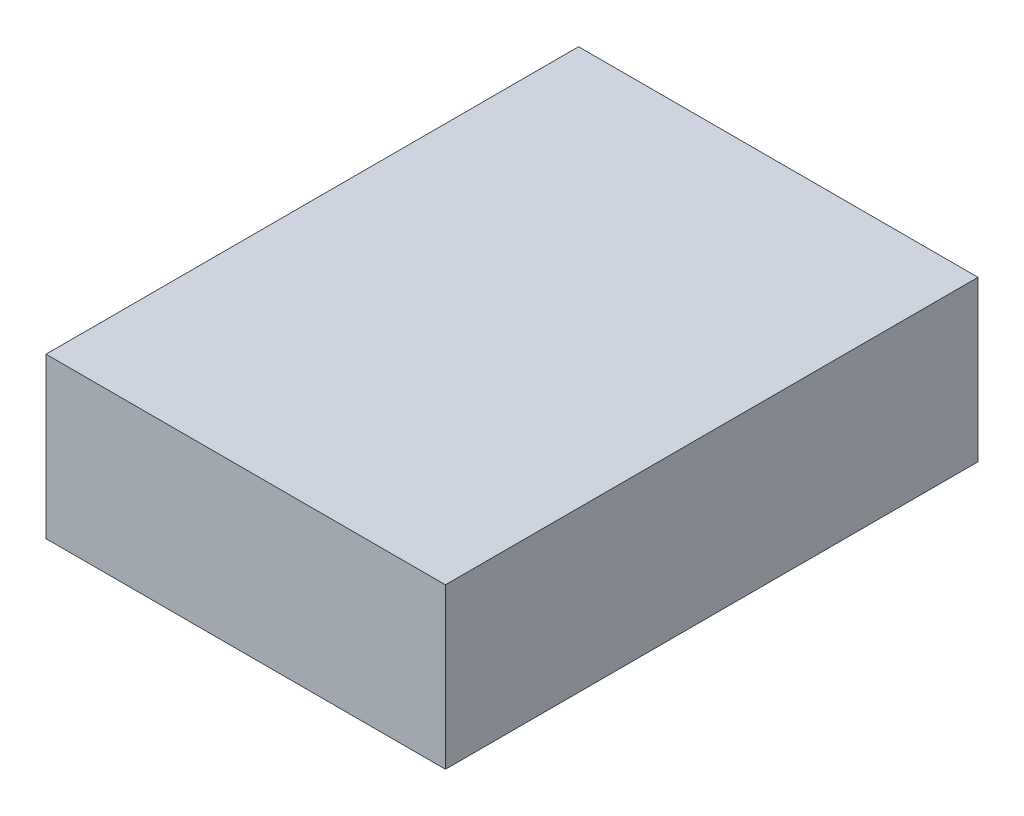
ISO-10303-21;
HEADER;
FILE_DESCRIPTION(('STEP AP214'),'2;1');
FILE_NAME('part.step','',(''),(''),'','','');
FILE_SCHEMA(('AUTOMOTIVE_DESIGN { 1 0 10303 214 1 1 1 1 }'));
ENDSEC;
DATA;
#1=APPLICATION_CONTEXT('core data for automotive mechanical design processes');
#2=APPLICATION_PROTOCOL_DEFINITION('international standard','automotive_design',2000,#1);
#3=PRODUCT_CONTEXT('',#1,'mechanical');
#4=PRODUCT('Part','Part','',(#3));
#5=PRODUCT_RELATED_PRODUCT_CATEGORY('part','',(#4));
#6=PRODUCT_DEFINITION_FORMATION('','',#4);
#7=PRODUCT_DEFINITION_CONTEXT('part definition',#1,'design');
#8=PRODUCT_DEFINITION('design','',#6,#7);
#9=PRODUCT_DEFINITION_SHAPE('','',#8);
#10=(LENGTH_UNIT() NAMED_UNIT(*) SI_UNIT(.MILLI.,.METRE.));
#11=(NAMED_UNIT(*) PLANE_ANGLE_UNIT() SI_UNIT($,.RADIAN.));
#12=(NAMED_UNIT(*) SI_UNIT($,.STERADIAN.) SOLID_ANGLE_UNIT());
#13=UNCERTAINTY_MEASURE_WITH_UNIT(LENGTH_MEASURE(1.E-05),#10,'distance_accuracy_value','');
#14=(GEOMETRIC_REPRESENTATION_CONTEXT(3) GLOBAL_UNCERTAINTY_ASSIGNED_CONTEXT((#13)) GLOBAL_UNIT_ASSIGNED_CONTEXT((#10,
#11,#12)) REPRESENTATION_CONTEXT('',''));
#15=CARTESIAN_POINT('',(0.,0.,0.));
#16=DIRECTION('',(0.,0.,1.));
#17=DIRECTION('',(1.,0.,0.));
#18=AXIS2_PLACEMENT_3D('',#15,#16,#17);
#19=CARTESIAN_POINT('',(15.,12.,20.));
#20=DIRECTION('',(-1.,0.,0.));
#21=DIRECTION('',(0.,0.,1.));
#22=AXIS2_PLACEMENT_3D('',#19,#20,#21);
#23=PLANE('',#22);
#24=DIRECTION('',(0.,0.,-1.));
#25=VECTOR('',#24,1.);
#26=CARTESIAN_POINT('',(15.,0.,20.));
#27=LINE('',#26,#25);
#28=CARTESIAN_POINT('',(15.,0.,20.));
#29=VERTEX_POINT('',#28);
#30=CARTESIAN_POINT('',(15.,0.,-20.));
#31=VERTEX_POINT('',#30);
#32=EDGE_CURVE('E110',#29,#31,#27,.T.);
#33=ORIENTED_EDGE('',*,*,#32,.T.);
#34=DIRECTION('',(0.,-1.,0.));
#35=VECTOR('',#34,1.);
#36=CARTESIAN_POINT('',(15.,12.,-20.));
#37=LINE('',#36,#35);
#38=CARTESIAN_POINT('',(15.,12.,-20.));
#39=VERTEX_POINT('',#38);
#40=EDGE_CURVE('E11',#39,#31,#37,.T.);
#41=ORIENTED_EDGE('',*,*,#40,.F.);
#42=DIRECTION('',(0.,0.,-1.));
#43=VECTOR('',#42,1.);
#44=CARTESIAN_POINT('',(15.,12.,20.));
#45=LINE('',#44,#43);
#46=CARTESIAN_POINT('',(15.,12.,20.));
#47=VERTEX_POINT('',#46);
#48=EDGE_CURVE('E111',#47,#39,#45,.T.);
#49=ORIENTED_EDGE('',*,*,#48,.F.);
#50=DIRECTION('',(0.,-1.,0.));
#51=VECTOR('',#50,1.);
#52=CARTESIAN_POINT('',(15.,12.,20.));
#53=LINE('',#52,#51);
#54=EDGE_CURVE('E117',#47,#29,#53,.T.);
#55=ORIENTED_EDGE('',*,*,#54,.T.);
#56=EDGE_LOOP('',(#33,#41,#49,#55));
#57=FACE_BOUND('',#56,.T.);
#58=ADVANCED_FACE('F17',(#57),#23,.F.);
#59=CARTESIAN_POINT('',(-15.,12.,-20.));
#60=DIRECTION('',(0.,0.,1.));
#61=DIRECTION('',(1.,0.,0.));
#62=AXIS2_PLACEMENT_3D('',#59,#60,#61);
#63=PLANE('',#62);
#64=DIRECTION('',(-1.,0.,0.));
#65=VECTOR('',#64,1.);
#66=CARTESIAN_POINT('',(-15.,0.,-20.));
#67=LINE('',#66,#65);
#68=CARTESIAN_POINT('',(-15.,0.,-20.));
#69=VERTEX_POINT('',#68);
#70=EDGE_CURVE('E120',#31,#69,#67,.T.);
#71=ORIENTED_EDGE('',*,*,#70,.T.);
#72=DIRECTION('',(0.,-1.,0.));
#73=VECTOR('',#72,1.);
#74=CARTESIAN_POINT('',(-15.,12.,-20.));
#75=LINE('',#74,#73);
#76=CARTESIAN_POINT('',(-15.,12.,-20.));
#77=VERTEX_POINT('',#76);
#78=EDGE_CURVE('E25',#77,#69,#75,.T.);
#79=ORIENTED_EDGE('',*,*,#78,.F.);
#80=DIRECTION('',(-1.,0.,0.));
#81=VECTOR('',#80,1.);
#82=CARTESIAN_POINT('',(-15.,12.,-20.));
#83=LINE('',#82,#81);
#84=EDGE_CURVE('E64',#39,#77,#83,.T.);
#85=ORIENTED_EDGE('',*,*,#84,.F.);
#86=ORIENTED_EDGE('',*,*,#40,.T.);
#87=EDGE_LOOP('',(#71,#79,#85,#86));
#88=FACE_BOUND('',#87,.T.);
#89=ADVANCED_FACE('F145',(#88),#63,.F.);
#90=CARTESIAN_POINT('',(-15.,12.,20.));
#91=DIRECTION('',(1.,0.,0.));
#92=DIRECTION('',(0.,0.,-1.));
#93=AXIS2_PLACEMENT_3D('',#90,#91,#92);
#94=PLANE('',#93);
#95=DIRECTION('',(0.,0.,1.));
#96=VECTOR('',#95,1.);
#97=CARTESIAN_POINT('',(-15.,0.,20.));
#98=LINE('',#97,#96);
#99=CARTESIAN_POINT('',(-15.,0.,20.));
#100=VERTEX_POINT('',#99);
#101=EDGE_CURVE('E51',#69,#100,#98,.T.);
#102=ORIENTED_EDGE('',*,*,#101,.T.);
#103=DIRECTION('',(0.,-1.,0.));
#104=VECTOR('',#103,1.);
#105=CARTESIAN_POINT('',(-15.,12.,20.));
#106=LINE('',#105,#104);
#107=CARTESIAN_POINT('',(-15.,12.,20.));
#108=VERTEX_POINT('',#107);
#109=EDGE_CURVE('E125',#108,#100,#106,.T.);
#110=ORIENTED_EDGE('',*,*,#109,.F.);
#111=DIRECTION('',(0.,0.,1.));
#112=VECTOR('',#111,1.);
#113=CARTESIAN_POINT('',(-15.,12.,20.));
#114=LINE('',#113,#112);
#115=EDGE_CURVE('E114',#77,#108,#114,.T.);
#116=ORIENTED_EDGE('',*,*,#115,.F.);
#117=ORIENTED_EDGE('',*,*,#78,.T.);
#118=EDGE_LOOP('',(#102,#110,#116,#117));
#119=FACE_BOUND('',#118,.T.);
#120=ADVANCED_FACE('F127',(#119),#94,.F.);
#121=CARTESIAN_POINT('',(-15.,12.,20.));
#122=DIRECTION('',(0.,0.,-1.));
#123=DIRECTION('',(-1.,0.,0.));
#124=AXIS2_PLACEMENT_3D('',#121,#122,#123);
#125=PLANE('',#124);
#126=DIRECTION('',(1.,0.,0.));
#127=VECTOR('',#126,1.);
#128=CARTESIAN_POINT('',(-15.,0.,20.));
#129=LINE('',#128,#127);
#130=EDGE_CURVE('E57',#100,#29,#129,.T.);
#131=ORIENTED_EDGE('',*,*,#130,.T.);
#132=ORIENTED_EDGE('',*,*,#54,.F.);
#133=DIRECTION('',(1.,0.,0.));
#134=VECTOR('',#133,1.);
#135=CARTESIAN_POINT('',(-15.,12.,20.));
#136=LINE('',#135,#134);
#137=EDGE_CURVE('E33',#108,#47,#136,.T.);
#138=ORIENTED_EDGE('',*,*,#137,.F.);
#139=ORIENTED_EDGE('',*,*,#109,.T.);
#140=EDGE_LOOP('',(#131,#132,#138,#139));
#141=FACE_BOUND('',#140,.T.);
#142=ADVANCED_FACE('F134',(#141),#125,.F.);
#143=CARTESIAN_POINT('',(15.,12.,-20.));
#144=DIRECTION('',(0.,-1.,0.));
#145=DIRECTION('',(0.,0.,-1.));
#146=AXIS2_PLACEMENT_3D('',#143,#144,#145);
#147=PLANE('',#146);
#148=ORIENTED_EDGE('',*,*,#48,.T.);
#149=ORIENTED_EDGE('',*,*,#84,.T.);
#150=ORIENTED_EDGE('',*,*,#115,.T.);
#151=ORIENTED_EDGE('',*,*,#137,.T.);
#152=EDGE_LOOP('',(#148,#149,#150,#151));
#153=FACE_BOUND('',#152,.T.);
#154=ADVANCED_FACE('F136',(#153),#147,.F.);
#155=CARTESIAN_POINT('',(15.,0.,-20.));
#156=DIRECTION('',(0.,-1.,0.));
#157=DIRECTION('',(0.,0.,-1.));
#158=AXIS2_PLACEMENT_3D('',#155,#156,#157);
#159=PLANE('',#158);
#160=CARTESIAN_POINT('',(-7.5,0.,10.));
#161=DIRECTION('',(0.,-1.,0.));
#162=DIRECTION('',(0.,0.,-1.));
#163=AXIS2_PLACEMENT_3D('',#160,#161,#162);
#164=CIRCLE('',#163,1.65);
#165=CARTESIAN_POINT('',(-7.5,0.,8.35));
#166=VERTEX_POINT('',#165);
#167=EDGE_CURVE('E88',#166,#166,#164,.T.);
#168=ORIENTED_EDGE('',*,*,#167,.F.);
#169=EDGE_LOOP('',(#168));
#170=FACE_BOUND('',#169,.T.);
#171=CARTESIAN_POINT('',(-7.5,0.,-10.));
#172=DIRECTION('',(0.,-1.,0.));
#173=DIRECTION('',(0.,0.,-1.));
#174=AXIS2_PLACEMENT_3D('',#171,#172,#173);
#175=CIRCLE('',#174,1.65);
#176=CARTESIAN_POINT('',(-7.5,0.,-11.65));
#177=VERTEX_POINT('',#176);
#178=EDGE_CURVE('E87',#177,#177,#175,.T.);
#179=ORIENTED_EDGE('',*,*,#178,.F.);
#180=EDGE_LOOP('',(#179));
#181=FACE_BOUND('',#180,.T.);
#182=CARTESIAN_POINT('',(7.5,0.,-10.));
#183=DIRECTION('',(0.,-1.,0.));
#184=DIRECTION('',(0.,0.,-1.));
#185=AXIS2_PLACEMENT_3D('',#182,#183,#184);
#186=CIRCLE('',#185,1.65);
#187=CARTESIAN_POINT('',(7.5,0.,-11.65));
#188=VERTEX_POINT('',#187);
#189=EDGE_CURVE('E98',#188,#188,#186,.T.);
#190=ORIENTED_EDGE('',*,*,#189,.F.);
#191=EDGE_LOOP('',(#190));
#192=FACE_BOUND('',#191,.T.);
#193=CARTESIAN_POINT('',(7.5,0.,10.));
#194=DIRECTION('',(0.,-1.,0.));
#195=DIRECTION('',(0.,0.,-1.));
#196=AXIS2_PLACEMENT_3D('',#193,#194,#195);
#197=CIRCLE('',#196,1.65);
#198=CARTESIAN_POINT('',(7.5,0.,8.35));
#199=VERTEX_POINT('',#198);
#200=EDGE_CURVE('E104',#199,#199,#197,.T.);
#201=ORIENTED_EDGE('',*,*,#200,.F.);
#202=EDGE_LOOP('',(#201));
#203=FACE_BOUND('',#202,.T.);
#204=ORIENTED_EDGE('',*,*,#32,.F.);
#205=ORIENTED_EDGE('',*,*,#130,.F.);
#206=ORIENTED_EDGE('',*,*,#101,.F.);
#207=ORIENTED_EDGE('',*,*,#70,.F.);
#208=EDGE_LOOP('',(#204,#205,#206,#207));
#209=FACE_BOUND('',#208,.T.);
#210=ADVANCED_FACE('F130',(#170,#181,#192,#203,#209),#159,.T.);
#211=CARTESIAN_POINT('',(7.5,8.,10.));
#212=DIRECTION('',(0.,-1.,0.));
#213=DIRECTION('',(0.,0.,-1.));
#214=AXIS2_PLACEMENT_3D('',#211,#212,#213);
#215=CONICAL_SURFACE('',#214,1.65,1.02974425867665);
#216=CARTESIAN_POINT('',(7.5,8.99142002139548,10.));
#217=VERTEX_POINT('',#216);
#218=VERTEX_LOOP('',#217);
#219=FACE_BOUND('',#218,.T.);
#220=CARTESIAN_POINT('',(7.5,8.,10.));
#221=DIRECTION('',(0.,-1.,0.));
#222=DIRECTION('',(0.,0.,-1.));
#223=AXIS2_PLACEMENT_3D('',#220,#221,#222);
#224=CIRCLE('',#223,1.65);
#225=CARTESIAN_POINT('',(7.5,8.,8.35));
#226=VERTEX_POINT('',#225);
#227=EDGE_CURVE('E107',#226,#226,#224,.T.);
#228=ORIENTED_EDGE('',*,*,#227,.T.);
#229=EDGE_LOOP('',(#228));
#230=FACE_BOUND('',#229,.T.);
#231=ADVANCED_FACE('F185',(#219,#230),#215,.F.);
#232=CARTESIAN_POINT('',(7.5,0.,10.));
#233=DIRECTION('',(0.,-1.,0.));
#234=DIRECTION('',(0.,0.,-1.));
#235=AXIS2_PLACEMENT_3D('',#232,#233,#234);
#236=CYLINDRICAL_SURFACE('',#235,1.65);
#237=ORIENTED_EDGE('',*,*,#227,.F.);
#238=EDGE_LOOP('',(#237));
#239=FACE_BOUND('',#238,.T.);
#240=ORIENTED_EDGE('',*,*,#200,.T.);
#241=EDGE_LOOP('',(#240));
#242=FACE_BOUND('',#241,.T.);
#243=ADVANCED_FACE('F194',(#239,#242),#236,.F.);
#244=CARTESIAN_POINT('',(7.5,8.,-10.));
#245=DIRECTION('',(0.,-1.,0.));
#246=DIRECTION('',(0.,0.,-1.));
#247=AXIS2_PLACEMENT_3D('',#244,#245,#246);
#248=CONICAL_SURFACE('',#247,1.65,1.02974425867665);
#249=CARTESIAN_POINT('',(7.5,8.99142002139548,-10.));
#250=VERTEX_POINT('',#249);
#251=VERTEX_LOOP('',#250);
#252=FACE_BOUND('',#251,.T.);
#253=CARTESIAN_POINT('',(7.5,8.,-10.));
#254=DIRECTION('',(0.,-1.,0.));
#255=DIRECTION('',(0.,0.,-1.));
#256=AXIS2_PLACEMENT_3D('',#253,#254,#255);
#257=CIRCLE('',#256,1.65);
#258=CARTESIAN_POINT('',(7.5,8.,-11.65));
#259=VERTEX_POINT('',#258);
#260=EDGE_CURVE('E101',#259,#259,#257,.T.);
#261=ORIENTED_EDGE('',*,*,#260,.T.);
#262=EDGE_LOOP('',(#261));
#263=FACE_BOUND('',#262,.T.);
#264=ADVANCED_FACE('F204',(#252,#263),#248,.F.);
#265=CARTESIAN_POINT('',(7.5,0.,-10.));
#266=DIRECTION('',(0.,-1.,0.));
#267=DIRECTION('',(0.,0.,-1.));
#268=AXIS2_PLACEMENT_3D('',#265,#266,#267);
#269=CYLINDRICAL_SURFACE('',#268,1.65);
#270=ORIENTED_EDGE('',*,*,#260,.F.);
#271=EDGE_LOOP('',(#270));
#272=FACE_BOUND('',#271,.T.);
#273=ORIENTED_EDGE('',*,*,#189,.T.);
#274=EDGE_LOOP('',(#273));
#275=FACE_BOUND('',#274,.T.);
#276=ADVANCED_FACE('F214',(#272,#275),#269,.F.);
#277=CARTESIAN_POINT('',(-7.5,8.,-10.));
#278=DIRECTION('',(0.,-1.,0.));
#279=DIRECTION('',(0.,0.,-1.));
#280=AXIS2_PLACEMENT_3D('',#277,#278,#279);
#281=CONICAL_SURFACE('',#280,1.65,1.02974425867665);
#282=CARTESIAN_POINT('',(-7.5,8.99142002139548,-10.));
#283=VERTEX_POINT('',#282);
#284=VERTEX_LOOP('',#283);
#285=FACE_BOUND('',#284,.T.);
#286=CARTESIAN_POINT('',(-7.5,8.,-10.));
#287=DIRECTION('',(0.,-1.,0.));
#288=DIRECTION('',(0.,0.,-1.));
#289=AXIS2_PLACEMENT_3D('',#286,#287,#288);
#290=CIRCLE('',#289,1.65);
#291=CARTESIAN_POINT('',(-7.5,8.,-11.65));
#292=VERTEX_POINT('',#291);
#293=EDGE_CURVE('E91',#292,#292,#290,.T.);
#294=ORIENTED_EDGE('',*,*,#293,.T.);
#295=EDGE_LOOP('',(#294));
#296=FACE_BOUND('',#295,.T.);
#297=ADVANCED_FACE('F224',(#285,#296),#281,.F.);
#298=CARTESIAN_POINT('',(-7.5,0.,-10.));
#299=DIRECTION('',(0.,-1.,0.));
#300=DIRECTION('',(0.,0.,-1.));
#301=AXIS2_PLACEMENT_3D('',#298,#299,#300);
#302=CYLINDRICAL_SURFACE('',#301,1.65);
#303=ORIENTED_EDGE('',*,*,#293,.F.);
#304=EDGE_LOOP('',(#303));
#305=FACE_BOUND('',#304,.T.);
#306=ORIENTED_EDGE('',*,*,#178,.T.);
#307=EDGE_LOOP('',(#306));
#308=FACE_BOUND('',#307,.T.);
#309=ADVANCED_FACE('F81',(#305,#308),#302,.F.);
#310=CARTESIAN_POINT('',(-7.5,8.,10.));
#311=DIRECTION('',(0.,-1.,0.));
#312=DIRECTION('',(0.,0.,-1.));
#313=AXIS2_PLACEMENT_3D('',#310,#311,#312);
#314=CONICAL_SURFACE('',#313,1.65,1.02974425867665);
#315=CARTESIAN_POINT('',(-7.5,8.99142002139548,10.));
#316=VERTEX_POINT('',#315);
#317=VERTEX_LOOP('',#316);
#318=FACE_BOUND('',#317,.T.);
#319=CARTESIAN_POINT('',(-7.5,8.,10.));
#320=DIRECTION('',(0.,-1.,0.));
#321=DIRECTION('',(0.,0.,-1.));
#322=AXIS2_PLACEMENT_3D('',#319,#320,#321);
#323=CIRCLE('',#322,1.65);
#324=CARTESIAN_POINT('',(-7.5,8.,8.35));
#325=VERTEX_POINT('',#324);
#326=EDGE_CURVE('E85',#325,#325,#323,.T.);
#327=ORIENTED_EDGE('',*,*,#326,.T.);
#328=EDGE_LOOP('',(#327));
#329=FACE_BOUND('',#328,.T.);
#330=ADVANCED_FACE('F77',(#318,#329),#314,.F.);
#331=CARTESIAN_POINT('',(-7.5,0.,10.));
#332=DIRECTION('',(0.,-1.,0.));
#333=DIRECTION('',(0.,0.,-1.));
#334=AXIS2_PLACEMENT_3D('',#331,#332,#333);
#335=CYLINDRICAL_SURFACE('',#334,1.65);
#336=ORIENTED_EDGE('',*,*,#326,.F.);
#337=EDGE_LOOP('',(#336));
#338=FACE_BOUND('',#337,.T.);
#339=ORIENTED_EDGE('',*,*,#167,.T.);
#340=EDGE_LOOP('',(#339));
#341=FACE_BOUND('',#340,.T.);
#342=ADVANCED_FACE('F80',(#338,#341),#335,.F.);
#343=CLOSED_SHELL('',(#58,#89,#120,#142,#154,#210,#231,#243,#264,#276,#297,#309,#330,#342));
#344=MANIFOLD_SOLID_BREP('B1',#343);
#345=ADVANCED_BREP_SHAPE_REPRESENTATION('',(#18,#344),#14);
#346=SHAPE_DEFINITION_REPRESENTATION(#9,#345);
ENDSEC;
END-ISO-10303-21;
